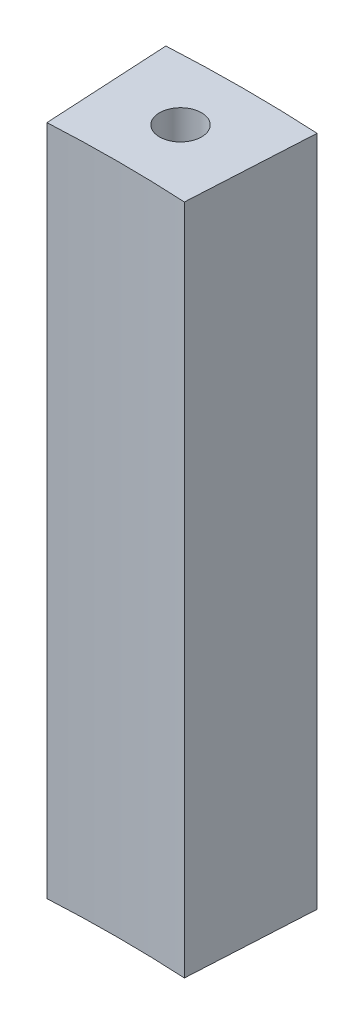
ISO-10303-21;
HEADER;
FILE_DESCRIPTION(('STEP AP214'),'2;1');
FILE_NAME('part.step','',(''),(''),'','','');
FILE_SCHEMA(('AUTOMOTIVE_DESIGN { 1 0 10303 214 1 1 1 1 }'));
ENDSEC;
DATA;
#1=APPLICATION_CONTEXT('core data for automotive mechanical design processes');
#2=APPLICATION_PROTOCOL_DEFINITION('international standard','automotive_design',2000,#1);
#3=PRODUCT_CONTEXT('',#1,'mechanical');
#4=PRODUCT('Part','Part','',(#3));
#5=PRODUCT_RELATED_PRODUCT_CATEGORY('part','',(#4));
#6=PRODUCT_DEFINITION_FORMATION('','',#4);
#7=PRODUCT_DEFINITION_CONTEXT('part definition',#1,'design');
#8=PRODUCT_DEFINITION('design','',#6,#7);
#9=PRODUCT_DEFINITION_SHAPE('','',#8);
#10=(LENGTH_UNIT() NAMED_UNIT(*) SI_UNIT(.MILLI.,.METRE.));
#11=(NAMED_UNIT(*) PLANE_ANGLE_UNIT() SI_UNIT($,.RADIAN.));
#12=(NAMED_UNIT(*) SI_UNIT($,.STERADIAN.) SOLID_ANGLE_UNIT());
#13=UNCERTAINTY_MEASURE_WITH_UNIT(LENGTH_MEASURE(1.E-05),#10,'distance_accuracy_value','');
#14=(GEOMETRIC_REPRESENTATION_CONTEXT(3) GLOBAL_UNCERTAINTY_ASSIGNED_CONTEXT((#13)) GLOBAL_UNIT_ASSIGNED_CONTEXT((#10,
#11,#12)) REPRESENTATION_CONTEXT('',''));
#15=CARTESIAN_POINT('',(0.,0.,0.));
#16=DIRECTION('',(0.,0.,1.));
#17=DIRECTION('',(1.,0.,0.));
#18=AXIS2_PLACEMENT_3D('',#15,#16,#17);
#19=CARTESIAN_POINT('',(0.,80.,0.));
#20=DIRECTION('',(0.,1.,0.));
#21=DIRECTION('',(0.,0.,1.));
#22=AXIS2_PLACEMENT_3D('',#19,#20,#21);
#23=PLANE('',#22);
#24=CARTESIAN_POINT('',(0.,80.,0.));
#25=DIRECTION('',(0.,-1.,0.));
#26=DIRECTION('',(0.,0.,1.));
#27=AXIS2_PLACEMENT_3D('',#24,#25,#26);
#28=CIRCLE('',#27,150.);
#29=CARTESIAN_POINT('',(-8.18181818181818,80.,-149.776693284502));
#30=VERTEX_POINT('',#29);
#31=CARTESIAN_POINT('',(8.18181818181818,80.,-149.776693284502));
#32=VERTEX_POINT('',#31);
#33=EDGE_CURVE('E92',#30,#32,#28,.T.);
#34=ORIENTED_EDGE('',*,*,#33,.T.);
#35=DIRECTION('',(0.0545454545454546,0.,-0.998511288563344));
#36=VECTOR('',#35,1.);
#37=CARTESIAN_POINT('',(8.18181818181818,80.,-149.776693284502));
#38=LINE('',#37,#36);
#39=CARTESIAN_POINT('',(8.99999999999996,80.,-164.754362612952));
#40=VERTEX_POINT('',#39);
#41=EDGE_CURVE('E87',#32,#40,#38,.T.);
#42=ORIENTED_EDGE('',*,*,#41,.T.);
#43=CARTESIAN_POINT('',(0.,80.,0.));
#44=DIRECTION('',(0.,1.,0.));
#45=DIRECTION('',(0.,0.,1.));
#46=AXIS2_PLACEMENT_3D('',#43,#44,#45);
#47=CIRCLE('',#46,165.);
#48=CARTESIAN_POINT('',(-9.,80.,-164.754362612952));
#49=VERTEX_POINT('',#48);
#50=EDGE_CURVE('E90',#40,#49,#47,.T.);
#51=ORIENTED_EDGE('',*,*,#50,.T.);
#52=DIRECTION('',(0.0545454545454548,0.,0.998511288563344));
#53=VECTOR('',#52,1.);
#54=CARTESIAN_POINT('',(-8.18181818181818,80.,-149.776693284502));
#55=LINE('',#54,#53);
#56=EDGE_CURVE('E57',#49,#30,#55,.T.);
#57=ORIENTED_EDGE('',*,*,#56,.T.);
#58=EDGE_LOOP('',(#34,#42,#51,#57));
#59=FACE_BOUND('',#58,.T.);
#60=CARTESIAN_POINT('',(0.,80.,-157.5));
#61=DIRECTION('',(0.,1.,0.));
#62=DIRECTION('',(0.,0.,1.));
#63=AXIS2_PLACEMENT_3D('',#60,#61,#62);
#64=CIRCLE('',#63,2.5);
#65=CARTESIAN_POINT('',(0.,80.,-155.));
#66=VERTEX_POINT('',#65);
#67=EDGE_CURVE('E112',#66,#66,#64,.T.);
#68=ORIENTED_EDGE('',*,*,#67,.F.);
#69=EDGE_LOOP('',(#68));
#70=FACE_BOUND('',#69,.T.);
#71=ADVANCED_FACE('F39',(#59,#70),#23,.T.);
#72=CARTESIAN_POINT('',(0.,0.,0.));
#73=DIRECTION('',(0.,1.,0.));
#74=DIRECTION('',(0.,0.,1.));
#75=AXIS2_PLACEMENT_3D('',#72,#73,#74);
#76=PLANE('',#75);
#77=CARTESIAN_POINT('',(0.,0.,0.));
#78=DIRECTION('',(0.,-1.,0.));
#79=DIRECTION('',(0.,0.,1.));
#80=AXIS2_PLACEMENT_3D('',#77,#78,#79);
#81=CIRCLE('',#80,150.);
#82=CARTESIAN_POINT('',(-8.18181818181818,0.,-149.776693284502));
#83=VERTEX_POINT('',#82);
#84=CARTESIAN_POINT('',(8.18181818181818,0.,-149.776693284502));
#85=VERTEX_POINT('',#84);
#86=EDGE_CURVE('E108',#83,#85,#81,.T.);
#87=ORIENTED_EDGE('',*,*,#86,.F.);
#88=DIRECTION('',(0.0545454545454548,0.,0.998511288563344));
#89=VECTOR('',#88,1.);
#90=CARTESIAN_POINT('',(-8.18181818181818,0.,-149.776693284502));
#91=LINE('',#90,#89);
#92=CARTESIAN_POINT('',(-9.,0.,-164.754362612952));
#93=VERTEX_POINT('',#92);
#94=EDGE_CURVE('E80',#93,#83,#91,.T.);
#95=ORIENTED_EDGE('',*,*,#94,.F.);
#96=CARTESIAN_POINT('',(0.,0.,0.));
#97=DIRECTION('',(0.,1.,0.));
#98=DIRECTION('',(0.,0.,1.));
#99=AXIS2_PLACEMENT_3D('',#96,#97,#98);
#100=CIRCLE('',#99,165.);
#101=CARTESIAN_POINT('',(8.99999999999996,0.,-164.754362612952));
#102=VERTEX_POINT('',#101);
#103=EDGE_CURVE('E74',#102,#93,#100,.T.);
#104=ORIENTED_EDGE('',*,*,#103,.F.);
#105=DIRECTION('',(0.0545454545454546,0.,-0.998511288563344));
#106=VECTOR('',#105,1.);
#107=CARTESIAN_POINT('',(8.18181818181818,0.,-149.776693284502));
#108=LINE('',#107,#106);
#109=EDGE_CURVE('E97',#85,#102,#108,.T.);
#110=ORIENTED_EDGE('',*,*,#109,.F.);
#111=EDGE_LOOP('',(#87,#95,#104,#110));
#112=FACE_BOUND('',#111,.T.);
#113=CARTESIAN_POINT('',(0.,0.,-157.5));
#114=DIRECTION('',(0.,1.,0.));
#115=DIRECTION('',(0.,0.,1.));
#116=AXIS2_PLACEMENT_3D('',#113,#114,#115);
#117=CIRCLE('',#116,2.5);
#118=CARTESIAN_POINT('',(0.,0.,-155.));
#119=VERTEX_POINT('',#118);
#120=EDGE_CURVE('E130',#119,#119,#117,.T.);
#121=ORIENTED_EDGE('',*,*,#120,.T.);
#122=EDGE_LOOP('',(#121));
#123=FACE_BOUND('',#122,.T.);
#124=ADVANCED_FACE('F125',(#112,#123),#76,.F.);
#125=CARTESIAN_POINT('',(0.,80.,0.));
#126=DIRECTION('',(0.,-1.,0.));
#127=DIRECTION('',(0.,0.,-1.));
#128=AXIS2_PLACEMENT_3D('',#125,#126,#127);
#129=CYLINDRICAL_SURFACE('',#128,150.);
#130=ORIENTED_EDGE('',*,*,#86,.T.);
#131=DIRECTION('',(0.,-1.,0.));
#132=VECTOR('',#131,1.);
#133=CARTESIAN_POINT('',(8.18181818181818,80.,-149.776693284502));
#134=LINE('',#133,#132);
#135=EDGE_CURVE('E11',#32,#85,#134,.T.);
#136=ORIENTED_EDGE('',*,*,#135,.F.);
#137=ORIENTED_EDGE('',*,*,#33,.F.);
#138=DIRECTION('',(0.,-1.,0.));
#139=VECTOR('',#138,1.);
#140=CARTESIAN_POINT('',(-8.18181818181818,80.,-149.776693284502));
#141=LINE('',#140,#139);
#142=EDGE_CURVE('E104',#30,#83,#141,.T.);
#143=ORIENTED_EDGE('',*,*,#142,.T.);
#144=EDGE_LOOP('',(#130,#136,#137,#143));
#145=FACE_BOUND('',#144,.T.);
#146=ADVANCED_FACE('F41',(#145),#129,.F.);
#147=CARTESIAN_POINT('',(8.18181818181818,80.,-149.776693284502));
#148=DIRECTION('',(-0.998511288563344,0.,-0.0545454545454546));
#149=DIRECTION('',(-0.0545454545454546,0.,0.998511288563344));
#150=AXIS2_PLACEMENT_3D('',#147,#148,#149);
#151=PLANE('',#150);
#152=ORIENTED_EDGE('',*,*,#109,.T.);
#153=DIRECTION('',(0.,-1.,0.));
#154=VECTOR('',#153,1.);
#155=CARTESIAN_POINT('',(8.99999999999996,80.,-164.754362612952));
#156=LINE('',#155,#154);
#157=EDGE_CURVE('E49',#40,#102,#156,.T.);
#158=ORIENTED_EDGE('',*,*,#157,.F.);
#159=ORIENTED_EDGE('',*,*,#41,.F.);
#160=ORIENTED_EDGE('',*,*,#135,.T.);
#161=EDGE_LOOP('',(#152,#158,#159,#160));
#162=FACE_BOUND('',#161,.T.);
#163=ADVANCED_FACE('F96',(#162),#151,.F.);
#164=CARTESIAN_POINT('',(0.,80.,0.));
#165=DIRECTION('',(0.,-1.,0.));
#166=DIRECTION('',(0.,0.,-1.));
#167=AXIS2_PLACEMENT_3D('',#164,#165,#166);
#168=CYLINDRICAL_SURFACE('',#167,165.);
#169=ORIENTED_EDGE('',*,*,#103,.T.);
#170=DIRECTION('',(0.,-1.,0.));
#171=VECTOR('',#170,1.);
#172=CARTESIAN_POINT('',(-9.,80.,-164.754362612952));
#173=LINE('',#172,#171);
#174=EDGE_CURVE('E99',#49,#93,#173,.T.);
#175=ORIENTED_EDGE('',*,*,#174,.F.);
#176=ORIENTED_EDGE('',*,*,#50,.F.);
#177=ORIENTED_EDGE('',*,*,#157,.T.);
#178=EDGE_LOOP('',(#169,#175,#176,#177));
#179=FACE_BOUND('',#178,.T.);
#180=ADVANCED_FACE('F100',(#179),#168,.T.);
#181=CARTESIAN_POINT('',(-8.18181818181818,80.,-149.776693284502));
#182=DIRECTION('',(0.998511288563344,0.,-0.0545454545454548));
#183=DIRECTION('',(-0.0545454545454548,0.,-0.998511288563344));
#184=AXIS2_PLACEMENT_3D('',#181,#182,#183);
#185=PLANE('',#184);
#186=ORIENTED_EDGE('',*,*,#94,.T.);
#187=ORIENTED_EDGE('',*,*,#142,.F.);
#188=ORIENTED_EDGE('',*,*,#56,.F.);
#189=ORIENTED_EDGE('',*,*,#174,.T.);
#190=EDGE_LOOP('',(#186,#187,#188,#189));
#191=FACE_BOUND('',#190,.T.);
#192=ADVANCED_FACE('F122',(#191),#185,.F.);
#193=CARTESIAN_POINT('',(0.,80.,-157.5));
#194=DIRECTION('',(0.,-1.,0.));
#195=DIRECTION('',(0.,0.,-1.));
#196=AXIS2_PLACEMENT_3D('',#193,#194,#195);
#197=CYLINDRICAL_SURFACE('',#196,2.5);
#198=ORIENTED_EDGE('',*,*,#67,.T.);
#199=EDGE_LOOP('',(#198));
#200=FACE_BOUND('',#199,.T.);
#201=ORIENTED_EDGE('',*,*,#120,.F.);
#202=EDGE_LOOP('',(#201));
#203=FACE_BOUND('',#202,.T.);
#204=ADVANCED_FACE('F138',(#200,#203),#197,.F.);
#205=CLOSED_SHELL('',(#71,#124,#146,#163,#180,#192,#204));
#206=MANIFOLD_SOLID_BREP('B2',#205);
#207=ADVANCED_BREP_SHAPE_REPRESENTATION('',(#18,#206),#14);
#208=SHAPE_DEFINITION_REPRESENTATION(#9,#207);
ENDSEC;
END-ISO-10303-21;
